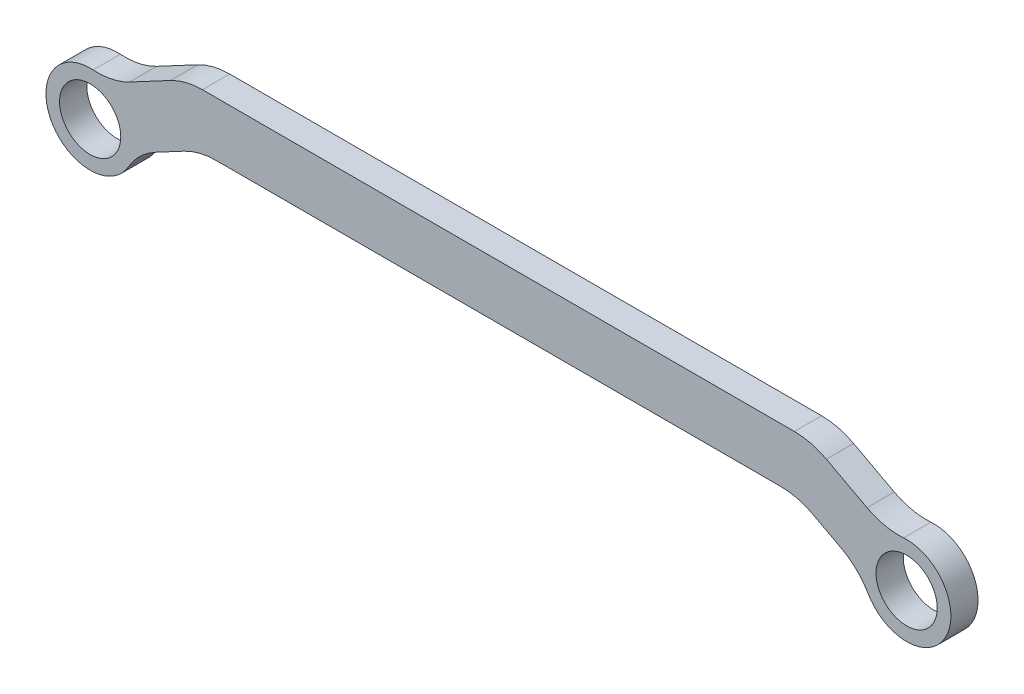
ISO-10303-21;
HEADER;
FILE_DESCRIPTION(('STEP AP214'),'2;1');
FILE_NAME('part.step','',(''),(''),'','','');
FILE_SCHEMA(('AUTOMOTIVE_DESIGN { 1 0 10303 214 1 1 1 1 }'));
ENDSEC;
DATA;
#1=APPLICATION_CONTEXT('core data for automotive mechanical design processes');
#2=APPLICATION_PROTOCOL_DEFINITION('international standard','automotive_design',2000,#1);
#3=PRODUCT_CONTEXT('',#1,'mechanical');
#4=PRODUCT('Part','Part','',(#3));
#5=PRODUCT_RELATED_PRODUCT_CATEGORY('part','',(#4));
#6=PRODUCT_DEFINITION_FORMATION('','',#4);
#7=PRODUCT_DEFINITION_CONTEXT('part definition',#1,'design');
#8=PRODUCT_DEFINITION('design','',#6,#7);
#9=PRODUCT_DEFINITION_SHAPE('','',#8);
#10=(LENGTH_UNIT() NAMED_UNIT(*) SI_UNIT(.MILLI.,.METRE.));
#11=(NAMED_UNIT(*) PLANE_ANGLE_UNIT() SI_UNIT($,.RADIAN.));
#12=(NAMED_UNIT(*) SI_UNIT($,.STERADIAN.) SOLID_ANGLE_UNIT());
#13=UNCERTAINTY_MEASURE_WITH_UNIT(LENGTH_MEASURE(1.E-05),#10,'distance_accuracy_value','');
#14=(GEOMETRIC_REPRESENTATION_CONTEXT(3) GLOBAL_UNCERTAINTY_ASSIGNED_CONTEXT((#13)) GLOBAL_UNIT_ASSIGNED_CONTEXT((#10,
#11,#12)) REPRESENTATION_CONTEXT('',''));
#15=CARTESIAN_POINT('',(0.,0.,0.));
#16=DIRECTION('',(0.,0.,1.));
#17=DIRECTION('',(1.,0.,0.));
#18=AXIS2_PLACEMENT_3D('',#15,#16,#17);
#19=CARTESIAN_POINT('',(24.6920415224913,46.2975778546712,4.));
#20=DIRECTION('',(0.470588235294117,0.882352941176471,0.));
#21=DIRECTION('',(-0.882352941176471,0.470588235294117,0.));
#22=AXIS2_PLACEMENT_3D('',#19,#20,#21);
#23=PLANE('',#22);
#24=DIRECTION('',(0.882352941176471,-0.470588235294117,0.));
#25=VECTOR('',#24,1.);
#26=CARTESIAN_POINT('',(24.6920415224913,46.2975778546712,0.));
#27=LINE('',#26,#25);
#28=CARTESIAN_POINT('',(106.205882352941,2.82352941176469,0.));
#29=VERTEX_POINT('',#28);
#30=CARTESIAN_POINT('',(110.412831236806,0.579823340370093,0.));
#31=VERTEX_POINT('',#30);
#32=EDGE_CURVE('E192',#29,#31,#27,.T.);
#33=ORIENTED_EDGE('',*,*,#32,.T.);
#34=DIRECTION('',(0.,0.,1.));
#35=VECTOR('',#34,1.);
#36=CARTESIAN_POINT('',(110.412831236806,0.579823340370121,4.));
#37=LINE('',#36,#35);
#38=CARTESIAN_POINT('',(110.412831236806,0.579823340370093,4.));
#39=VERTEX_POINT('',#38);
#40=EDGE_CURVE('E164',#31,#39,#37,.T.);
#41=ORIENTED_EDGE('',*,*,#40,.T.);
#42=DIRECTION('',(0.882352941176471,-0.470588235294117,0.));
#43=VECTOR('',#42,1.);
#44=CARTESIAN_POINT('',(24.6920415224913,46.2975778546712,4.));
#45=LINE('',#44,#43);
#46=CARTESIAN_POINT('',(106.205882352941,2.82352941176469,4.));
#47=VERTEX_POINT('',#46);
#48=EDGE_CURVE('E226',#47,#39,#45,.T.);
#49=ORIENTED_EDGE('',*,*,#48,.F.);
#50=DIRECTION('',(0.,0.,-1.));
#51=VECTOR('',#50,1.);
#52=CARTESIAN_POINT('',(106.205882352941,2.82352941176471,0.));
#53=LINE('',#52,#51);
#54=EDGE_CURVE('E182',#47,#29,#53,.T.);
#55=ORIENTED_EDGE('',*,*,#54,.T.);
#56=EDGE_LOOP('',(#33,#41,#49,#55));
#57=FACE_BOUND('',#56,.T.);
#58=ADVANCED_FACE('F44',(#57),#23,.F.);
#59=CARTESIAN_POINT('',(120.,0.,4.));
#60=DIRECTION('',(0.,0.,-1.));
#61=DIRECTION('',(-1.,0.,0.));
#62=AXIS2_PLACEMENT_3D('',#59,#60,#61);
#63=CYLINDRICAL_SURFACE('',#62,6.50000000000001);
#64=CARTESIAN_POINT('',(120.,0.,4.));
#65=DIRECTION('',(0.,0.,1.));
#66=DIRECTION('',(1.,0.,0.));
#67=AXIS2_PLACEMENT_3D('',#64,#65,#66);
#68=CIRCLE('',#67,6.50000000000001);
#69=CARTESIAN_POINT('',(114.369404105765,-3.2475205735797,4.));
#70=VERTEX_POINT('',#69);
#71=CARTESIAN_POINT('',(119.560134943555,6.48509974727594,4.));
#72=VERTEX_POINT('',#71);
#73=EDGE_CURVE('E180',#70,#72,#68,.T.);
#74=ORIENTED_EDGE('',*,*,#73,.F.);
#75=DIRECTION('',(0.,0.,-1.));
#76=VECTOR('',#75,1.);
#77=CARTESIAN_POINT('',(114.369404105765,-3.24752057357969,4.));
#78=LINE('',#77,#76);
#79=CARTESIAN_POINT('',(114.369404105765,-3.2475205735797,0.));
#80=VERTEX_POINT('',#79);
#81=EDGE_CURVE('E163',#70,#80,#78,.T.);
#82=ORIENTED_EDGE('',*,*,#81,.T.);
#83=CARTESIAN_POINT('',(120.,0.,0.));
#84=DIRECTION('',(0.,0.,1.));
#85=DIRECTION('',(1.,0.,0.));
#86=AXIS2_PLACEMENT_3D('',#83,#84,#85);
#87=CIRCLE('',#86,6.50000000000001);
#88=CARTESIAN_POINT('',(119.560134943555,6.48509974727594,0.));
#89=VERTEX_POINT('',#88);
#90=EDGE_CURVE('E177',#80,#89,#87,.T.);
#91=ORIENTED_EDGE('',*,*,#90,.T.);
#92=DIRECTION('',(0.,0.,-1.));
#93=VECTOR('',#92,1.);
#94=CARTESIAN_POINT('',(119.560134943555,6.48509974727594,4.));
#95=LINE('',#94,#93);
#96=EDGE_CURVE('E183',#89,#72,#95,.F.);
#97=ORIENTED_EDGE('',*,*,#96,.T.);
#98=EDGE_LOOP('',(#74,#82,#91,#97));
#99=FACE_BOUND('',#98,.T.);
#100=ADVANCED_FACE('F176',(#99),#63,.T.);
#101=CARTESIAN_POINT('',(28.4567474048442,53.356401384083,4.));
#102=DIRECTION('',(0.470588235294117,0.882352941176471,0.));
#103=DIRECTION('',(-0.882352941176471,0.470588235294117,0.));
#104=AXIS2_PLACEMENT_3D('',#101,#102,#103);
#105=PLANE('',#104);
#106=DIRECTION('',(0.882352941176471,-0.470588235294117,0.));
#107=VECTOR('',#106,1.);
#108=CARTESIAN_POINT('',(28.4567474048442,53.356401384083,4.));
#109=LINE('',#108,#107);
#110=CARTESIAN_POINT('',(108.205882352941,10.8235294117647,4.));
#111=VERTEX_POINT('',#110);
#112=CARTESIAN_POINT('',(114.177537119159,7.63864686978188,4.));
#113=VERTEX_POINT('',#112);
#114=EDGE_CURVE('E417',#111,#113,#109,.T.);
#115=ORIENTED_EDGE('',*,*,#114,.T.);
#116=DIRECTION('',(0.,0.,-1.));
#117=VECTOR('',#116,1.);
#118=CARTESIAN_POINT('',(114.177537119159,7.63864686978189,4.));
#119=LINE('',#118,#117);
#120=CARTESIAN_POINT('',(114.177537119159,7.63864686978188,0.));
#121=VERTEX_POINT('',#120);
#122=EDGE_CURVE('E238',#113,#121,#119,.T.);
#123=ORIENTED_EDGE('',*,*,#122,.T.);
#124=DIRECTION('',(0.882352941176471,-0.470588235294117,0.));
#125=VECTOR('',#124,1.);
#126=CARTESIAN_POINT('',(28.4567474048442,53.356401384083,0.));
#127=LINE('',#126,#125);
#128=CARTESIAN_POINT('',(108.205882352941,10.8235294117647,0.));
#129=VERTEX_POINT('',#128);
#130=EDGE_CURVE('E191',#129,#121,#127,.T.);
#131=ORIENTED_EDGE('',*,*,#130,.F.);
#132=DIRECTION('',(0.,0.,-1.));
#133=VECTOR('',#132,1.);
#134=CARTESIAN_POINT('',(108.205882352941,10.8235294117647,4.));
#135=LINE('',#134,#133);
#136=EDGE_CURVE('E235',#129,#111,#135,.F.);
#137=ORIENTED_EDGE('',*,*,#136,.T.);
#138=EDGE_LOOP('',(#115,#123,#131,#137));
#139=FACE_BOUND('',#138,.T.);
#140=ADVANCED_FACE('F370',(#139),#105,.T.);
#141=CARTESIAN_POINT('',(0.,12.,4.));
#142=DIRECTION('',(0.,1.,0.));
#143=DIRECTION('',(0.,0.,1.));
#144=AXIS2_PLACEMENT_3D('',#141,#142,#143);
#145=PLANE('',#144);
#146=DIRECTION('',(1.,0.,0.));
#147=VECTOR('',#146,1.);
#148=CARTESIAN_POINT('',(0.,12.,4.));
#149=LINE('',#148,#147);
#150=CARTESIAN_POINT('',(16.5,12.,4.));
#151=VERTEX_POINT('',#150);
#152=CARTESIAN_POINT('',(103.5,12.,4.));
#153=VERTEX_POINT('',#152);
#154=EDGE_CURVE('E338',#151,#153,#149,.T.);
#155=ORIENTED_EDGE('',*,*,#154,.T.);
#156=DIRECTION('',(0.,0.,-1.));
#157=VECTOR('',#156,1.);
#158=CARTESIAN_POINT('',(103.5,12.,4.));
#159=LINE('',#158,#157);
#160=CARTESIAN_POINT('',(103.5,12.,0.));
#161=VERTEX_POINT('',#160);
#162=EDGE_CURVE('E252',#153,#161,#159,.T.);
#163=ORIENTED_EDGE('',*,*,#162,.T.);
#164=DIRECTION('',(1.,0.,0.));
#165=VECTOR('',#164,1.);
#166=CARTESIAN_POINT('',(0.,12.,0.));
#167=LINE('',#166,#165);
#168=CARTESIAN_POINT('',(16.5,12.,0.));
#169=VERTEX_POINT('',#168);
#170=EDGE_CURVE('E196',#169,#161,#167,.T.);
#171=ORIENTED_EDGE('',*,*,#170,.F.);
#172=DIRECTION('',(0.,0.,-1.));
#173=VECTOR('',#172,1.);
#174=CARTESIAN_POINT('',(16.5,12.,4.));
#175=LINE('',#174,#173);
#176=EDGE_CURVE('E249',#169,#151,#175,.F.);
#177=ORIENTED_EDGE('',*,*,#176,.T.);
#178=EDGE_LOOP('',(#155,#163,#171,#177));
#179=FACE_BOUND('',#178,.T.);
#180=ADVANCED_FACE('F427',(#179),#145,.T.);
#181=CARTESIAN_POINT('',(-1.88235294117647,3.52941176470588,4.));
#182=DIRECTION('',(-0.470588235294118,0.88235294117647,0.));
#183=DIRECTION('',(-0.882352941176471,-0.470588235294118,0.));
#184=AXIS2_PLACEMENT_3D('',#181,#182,#183);
#185=PLANE('',#184);
#186=DIRECTION('',(0.882352941176471,0.470588235294118,0.));
#187=VECTOR('',#186,1.);
#188=CARTESIAN_POINT('',(-1.88235294117647,3.52941176470588,4.));
#189=LINE('',#188,#187);
#190=CARTESIAN_POINT('',(5.82246288084103,7.63864686978188,4.));
#191=VERTEX_POINT('',#190);
#192=CARTESIAN_POINT('',(11.7941176470588,10.8235294117647,4.));
#193=VERTEX_POINT('',#192);
#194=EDGE_CURVE('E327',#191,#193,#189,.T.);
#195=ORIENTED_EDGE('',*,*,#194,.T.);
#196=DIRECTION('',(0.,0.,-1.));
#197=VECTOR('',#196,1.);
#198=CARTESIAN_POINT('',(11.7941176470588,10.8235294117647,4.));
#199=LINE('',#198,#197);
#200=CARTESIAN_POINT('',(11.7941176470588,10.8235294117647,0.));
#201=VERTEX_POINT('',#200);
#202=EDGE_CURVE('E277',#193,#201,#199,.T.);
#203=ORIENTED_EDGE('',*,*,#202,.T.);
#204=DIRECTION('',(0.882352941176471,0.470588235294118,0.));
#205=VECTOR('',#204,1.);
#206=CARTESIAN_POINT('',(-1.88235294117647,3.52941176470588,0.));
#207=LINE('',#206,#205);
#208=CARTESIAN_POINT('',(5.82246288084103,7.63864686978188,0.));
#209=VERTEX_POINT('',#208);
#210=EDGE_CURVE('E203',#209,#201,#207,.T.);
#211=ORIENTED_EDGE('',*,*,#210,.F.);
#212=DIRECTION('',(0.,0.,-1.));
#213=VECTOR('',#212,1.);
#214=CARTESIAN_POINT('',(5.82246288084103,7.63864686978188,4.));
#215=LINE('',#214,#213);
#216=EDGE_CURVE('E274',#209,#191,#215,.F.);
#217=ORIENTED_EDGE('',*,*,#216,.T.);
#218=EDGE_LOOP('',(#195,#203,#211,#217));
#219=FACE_BOUND('',#218,.T.);
#220=ADVANCED_FACE('F318',(#219),#185,.T.);
#221=CARTESIAN_POINT('',(0.,0.,4.));
#222=DIRECTION('',(0.,0.,-1.));
#223=DIRECTION('',(-1.,0.,0.));
#224=AXIS2_PLACEMENT_3D('',#221,#222,#223);
#225=CYLINDRICAL_SURFACE('',#224,6.5);
#226=CARTESIAN_POINT('',(0.,0.,0.));
#227=DIRECTION('',(0.,0.,1.));
#228=DIRECTION('',(1.,0.,0.));
#229=AXIS2_PLACEMENT_3D('',#226,#227,#228);
#230=CIRCLE('',#229,6.5);
#231=CARTESIAN_POINT('',(0.439865056445396,6.48509974727593,0.));
#232=VERTEX_POINT('',#231);
#233=CARTESIAN_POINT('',(5.63059589423506,-3.24752057357969,0.));
#234=VERTEX_POINT('',#233);
#235=EDGE_CURVE('E207',#232,#234,#230,.T.);
#236=ORIENTED_EDGE('',*,*,#235,.T.);
#237=DIRECTION('',(0.,0.,-1.));
#238=VECTOR('',#237,1.);
#239=CARTESIAN_POINT('',(5.63059589423506,-3.24752057357969,4.));
#240=LINE('',#239,#238);
#241=CARTESIAN_POINT('',(5.63059589423506,-3.24752057357969,4.));
#242=VERTEX_POINT('',#241);
#243=EDGE_CURVE('E171',#234,#242,#240,.F.);
#244=ORIENTED_EDGE('',*,*,#243,.T.);
#245=CARTESIAN_POINT('',(0.,0.,4.));
#246=DIRECTION('',(0.,0.,1.));
#247=DIRECTION('',(1.,0.,0.));
#248=AXIS2_PLACEMENT_3D('',#245,#246,#247);
#249=CIRCLE('',#248,6.5);
#250=CARTESIAN_POINT('',(0.439865056445396,6.48509974727593,4.));
#251=VERTEX_POINT('',#250);
#252=EDGE_CURVE('E326',#251,#242,#249,.T.);
#253=ORIENTED_EDGE('',*,*,#252,.F.);
#254=DIRECTION('',(0.,0.,-1.));
#255=VECTOR('',#254,1.);
#256=CARTESIAN_POINT('',(0.439865056445396,6.48509974727593,4.));
#257=LINE('',#256,#255);
#258=EDGE_CURVE('E281',#251,#232,#257,.T.);
#259=ORIENTED_EDGE('',*,*,#258,.T.);
#260=EDGE_LOOP('',(#236,#244,#253,#259));
#261=FACE_BOUND('',#260,.T.);
#262=ADVANCED_FACE('F329',(#261),#225,.T.);
#263=CARTESIAN_POINT('',(1.88235294117647,-3.52941176470588,4.));
#264=DIRECTION('',(-0.470588235294118,0.88235294117647,0.));
#265=DIRECTION('',(-0.882352941176471,-0.470588235294118,0.));
#266=AXIS2_PLACEMENT_3D('',#263,#264,#265);
#267=PLANE('',#266);
#268=DIRECTION('',(0.882352941176471,0.470588235294118,0.));
#269=VECTOR('',#268,1.);
#270=CARTESIAN_POINT('',(1.88235294117647,-3.52941176470588,0.));
#271=LINE('',#270,#269);
#272=CARTESIAN_POINT('',(9.58716876319397,0.579823340370114,0.));
#273=VERTEX_POINT('',#272);
#274=CARTESIAN_POINT('',(13.7941176470588,2.82352941176471,0.));
#275=VERTEX_POINT('',#274);
#276=EDGE_CURVE('E211',#273,#275,#271,.T.);
#277=ORIENTED_EDGE('',*,*,#276,.T.);
#278=DIRECTION('',(0.,0.,-1.));
#279=VECTOR('',#278,1.);
#280=CARTESIAN_POINT('',(13.7941176470588,2.8235294117647,4.));
#281=LINE('',#280,#279);
#282=CARTESIAN_POINT('',(13.7941176470588,2.82352941176471,4.));
#283=VERTEX_POINT('',#282);
#284=EDGE_CURVE('E60',#275,#283,#281,.F.);
#285=ORIENTED_EDGE('',*,*,#284,.T.);
#286=DIRECTION('',(0.882352941176471,0.470588235294118,0.));
#287=VECTOR('',#286,1.);
#288=CARTESIAN_POINT('',(1.88235294117647,-3.52941176470588,4.));
#289=LINE('',#288,#287);
#290=CARTESIAN_POINT('',(9.58716876319397,0.579823340370114,4.));
#291=VERTEX_POINT('',#290);
#292=EDGE_CURVE('E332',#291,#283,#289,.T.);
#293=ORIENTED_EDGE('',*,*,#292,.F.);
#294=DIRECTION('',(0.,0.,1.));
#295=VECTOR('',#294,1.);
#296=CARTESIAN_POINT('',(9.58716876319396,0.579823340370113,0.));
#297=LINE('',#296,#295);
#298=EDGE_CURVE('E268',#291,#273,#297,.F.);
#299=ORIENTED_EDGE('',*,*,#298,.T.);
#300=EDGE_LOOP('',(#277,#285,#293,#299));
#301=FACE_BOUND('',#300,.T.);
#302=ADVANCED_FACE('F403',(#301),#267,.F.);
#303=CARTESIAN_POINT('',(0.,0.,4.));
#304=DIRECTION('',(0.,0.,-1.));
#305=DIRECTION('',(-1.,0.,0.));
#306=AXIS2_PLACEMENT_3D('',#303,#304,#305);
#307=CYLINDRICAL_SURFACE('',#306,4.5);
#308=CARTESIAN_POINT('',(0.,0.,4.));
#309=DIRECTION('',(0.,0.,1.));
#310=DIRECTION('',(1.,0.,0.));
#311=AXIS2_PLACEMENT_3D('',#308,#309,#310);
#312=CIRCLE('',#311,4.5);
#313=CARTESIAN_POINT('',(4.5,0.,4.));
#314=VERTEX_POINT('',#313);
#315=EDGE_CURVE('E345',#314,#314,#312,.T.);
#316=ORIENTED_EDGE('',*,*,#315,.T.);
#317=EDGE_LOOP('',(#316));
#318=FACE_BOUND('',#317,.T.);
#319=CARTESIAN_POINT('',(0.,0.,0.));
#320=DIRECTION('',(0.,0.,1.));
#321=DIRECTION('',(1.,0.,0.));
#322=AXIS2_PLACEMENT_3D('',#319,#320,#321);
#323=CIRCLE('',#322,4.5);
#324=CARTESIAN_POINT('',(4.5,0.,0.));
#325=VERTEX_POINT('',#324);
#326=EDGE_CURVE('E218',#325,#325,#323,.T.);
#327=ORIENTED_EDGE('',*,*,#326,.F.);
#328=EDGE_LOOP('',(#327));
#329=FACE_BOUND('',#328,.T.);
#330=ADVANCED_FACE('F449',(#318,#329),#307,.F.);
#331=CARTESIAN_POINT('',(0.,4.,4.));
#332=DIRECTION('',(0.,1.,0.));
#333=DIRECTION('',(0.,0.,1.));
#334=AXIS2_PLACEMENT_3D('',#331,#332,#333);
#335=PLANE('',#334);
#336=DIRECTION('',(1.,0.,0.));
#337=VECTOR('',#336,1.);
#338=CARTESIAN_POINT('',(0.,4.,0.));
#339=LINE('',#338,#337);
#340=CARTESIAN_POINT('',(18.5,4.,0.));
#341=VERTEX_POINT('',#340);
#342=CARTESIAN_POINT('',(101.5,4.,0.));
#343=VERTEX_POINT('',#342);
#344=EDGE_CURVE('E214',#341,#343,#339,.T.);
#345=ORIENTED_EDGE('',*,*,#344,.T.);
#346=DIRECTION('',(0.,0.,-1.));
#347=VECTOR('',#346,1.);
#348=CARTESIAN_POINT('',(101.5,4.,4.));
#349=LINE('',#348,#347);
#350=CARTESIAN_POINT('',(101.5,4.,4.));
#351=VERTEX_POINT('',#350);
#352=EDGE_CURVE('E246',#343,#351,#349,.F.);
#353=ORIENTED_EDGE('',*,*,#352,.T.);
#354=DIRECTION('',(1.,0.,0.));
#355=VECTOR('',#354,1.);
#356=CARTESIAN_POINT('',(0.,4.,4.));
#357=LINE('',#356,#355);
#358=CARTESIAN_POINT('',(18.5,4.,4.));
#359=VERTEX_POINT('',#358);
#360=EDGE_CURVE('E336',#359,#351,#357,.T.);
#361=ORIENTED_EDGE('',*,*,#360,.F.);
#362=DIRECTION('',(0.,0.,-1.));
#363=VECTOR('',#362,1.);
#364=CARTESIAN_POINT('',(18.5,4.,0.));
#365=LINE('',#364,#363);
#366=EDGE_CURVE('E242',#359,#341,#365,.T.);
#367=ORIENTED_EDGE('',*,*,#366,.T.);
#368=EDGE_LOOP('',(#345,#353,#361,#367));
#369=FACE_BOUND('',#368,.T.);
#370=ADVANCED_FACE('F362',(#369),#335,.F.);
#371=CARTESIAN_POINT('',(120.,0.,4.));
#372=DIRECTION('',(0.,0.,-1.));
#373=DIRECTION('',(-1.,0.,0.));
#374=AXIS2_PLACEMENT_3D('',#371,#372,#373);
#375=CYLINDRICAL_SURFACE('',#374,4.5);
#376=CARTESIAN_POINT('',(120.,0.,4.));
#377=DIRECTION('',(0.,0.,1.));
#378=DIRECTION('',(1.,0.,0.));
#379=AXIS2_PLACEMENT_3D('',#376,#377,#378);
#380=CIRCLE('',#379,4.5);
#381=CARTESIAN_POINT('',(124.5,0.,4.));
#382=VERTEX_POINT('',#381);
#383=EDGE_CURVE('E228',#382,#382,#380,.T.);
#384=ORIENTED_EDGE('',*,*,#383,.T.);
#385=EDGE_LOOP('',(#384));
#386=FACE_BOUND('',#385,.T.);
#387=CARTESIAN_POINT('',(120.,0.,0.));
#388=DIRECTION('',(0.,0.,1.));
#389=DIRECTION('',(1.,0.,0.));
#390=AXIS2_PLACEMENT_3D('',#387,#388,#389);
#391=CIRCLE('',#390,4.5);
#392=CARTESIAN_POINT('',(124.5,0.,0.));
#393=VERTEX_POINT('',#392);
#394=EDGE_CURVE('E222',#393,#393,#391,.T.);
#395=ORIENTED_EDGE('',*,*,#394,.F.);
#396=EDGE_LOOP('',(#395));
#397=FACE_BOUND('',#396,.T.);
#398=ADVANCED_FACE('F352',(#386,#397),#375,.F.);
#399=CARTESIAN_POINT('',(0.,0.,4.));
#400=DIRECTION('',(0.,0.,1.));
#401=DIRECTION('',(1.,0.,0.));
#402=AXIS2_PLACEMENT_3D('',#399,#400,#401);
#403=PLANE('',#402);
#404=ORIENTED_EDGE('',*,*,#114,.F.);
#405=CARTESIAN_POINT('',(103.5,2.,4.));
#406=DIRECTION('',(0.,0.,1.));
#407=DIRECTION('',(1.,0.,0.));
#408=AXIS2_PLACEMENT_3D('',#405,#406,#407);
#409=CIRCLE('',#408,10.);
#410=EDGE_CURVE('E265',#111,#153,#409,.T.);
#411=ORIENTED_EDGE('',*,*,#410,.T.);
#412=ORIENTED_EDGE('',*,*,#154,.F.);
#413=CARTESIAN_POINT('',(16.5,2.,4.));
#414=DIRECTION('',(0.,0.,1.));
#415=DIRECTION('',(1.,0.,0.));
#416=AXIS2_PLACEMENT_3D('',#413,#414,#415);
#417=CIRCLE('',#416,10.);
#418=EDGE_CURVE('E262',#151,#193,#417,.T.);
#419=ORIENTED_EDGE('',*,*,#418,.T.);
#420=ORIENTED_EDGE('',*,*,#194,.F.);
#421=CARTESIAN_POINT('',(1.11658052789985,16.4621762815466,4.));
#422=DIRECTION('',(0.,0.,1.));
#423=DIRECTION('',(1.,0.,0.));
#424=AXIS2_PLACEMENT_3D('',#421,#422,#423);
#425=CIRCLE('',#424,10.);
#426=EDGE_CURVE('E11',#191,#251,#425,.F.);
#427=ORIENTED_EDGE('',*,*,#426,.T.);
#428=ORIENTED_EDGE('',*,*,#252,.T.);
#429=CARTESIAN_POINT('',(14.2930511161351,-8.24370607139459,4.));
#430=DIRECTION('',(0.,0.,1.));
#431=DIRECTION('',(1.,0.,0.));
#432=AXIS2_PLACEMENT_3D('',#429,#430,#431);
#433=CIRCLE('',#432,10.);
#434=EDGE_CURVE('E67',#242,#291,#433,.F.);
#435=ORIENTED_EDGE('',*,*,#434,.T.);
#436=ORIENTED_EDGE('',*,*,#292,.T.);
#437=CARTESIAN_POINT('',(18.5,-6.,4.));
#438=DIRECTION('',(0.,0.,1.));
#439=DIRECTION('',(1.,0.,0.));
#440=AXIS2_PLACEMENT_3D('',#437,#438,#439);
#441=CIRCLE('',#440,10.);
#442=EDGE_CURVE('E303',#283,#359,#441,.F.);
#443=ORIENTED_EDGE('',*,*,#442,.T.);
#444=ORIENTED_EDGE('',*,*,#360,.T.);
#445=CARTESIAN_POINT('',(101.5,-6.,4.));
#446=DIRECTION('',(0.,0.,1.));
#447=DIRECTION('',(1.,0.,0.));
#448=AXIS2_PLACEMENT_3D('',#445,#446,#447);
#449=CIRCLE('',#448,10.);
#450=EDGE_CURVE('E297',#351,#47,#449,.F.);
#451=ORIENTED_EDGE('',*,*,#450,.T.);
#452=ORIENTED_EDGE('',*,*,#48,.T.);
#453=CARTESIAN_POINT('',(105.706948883865,-8.24370607139459,4.));
#454=DIRECTION('',(0.,0.,1.));
#455=DIRECTION('',(1.,0.,0.));
#456=AXIS2_PLACEMENT_3D('',#453,#454,#455);
#457=CIRCLE('',#456,10.);
#458=EDGE_CURVE('E170',#39,#70,#457,.F.);
#459=ORIENTED_EDGE('',*,*,#458,.T.);
#460=ORIENTED_EDGE('',*,*,#73,.T.);
#461=CARTESIAN_POINT('',(118.8834194721,16.4621762815466,4.));
#462=DIRECTION('',(0.,0.,1.));
#463=DIRECTION('',(1.,0.,0.));
#464=AXIS2_PLACEMENT_3D('',#461,#462,#463);
#465=CIRCLE('',#464,10.);
#466=EDGE_CURVE('E291',#72,#113,#465,.F.);
#467=ORIENTED_EDGE('',*,*,#466,.T.);
#468=EDGE_LOOP('',(#404,#411,#412,#419,#420,#427,#428,#435,#436,#443,#444,#451,#452,#459,#460,#467));
#469=FACE_BOUND('',#468,.T.);
#470=ORIENTED_EDGE('',*,*,#315,.F.);
#471=EDGE_LOOP('',(#470));
#472=FACE_BOUND('',#471,.T.);
#473=ORIENTED_EDGE('',*,*,#383,.F.);
#474=EDGE_LOOP('',(#473));
#475=FACE_BOUND('',#474,.T.);
#476=ADVANCED_FACE('F324',(#469,#472,#475),#403,.T.);
#477=CARTESIAN_POINT('',(0.,0.,0.));
#478=DIRECTION('',(0.,0.,1.));
#479=DIRECTION('',(1.,0.,0.));
#480=AXIS2_PLACEMENT_3D('',#477,#478,#479);
#481=PLANE('',#480);
#482=ORIENTED_EDGE('',*,*,#170,.T.);
#483=CARTESIAN_POINT('',(103.5,2.,0.));
#484=DIRECTION('',(0.,0.,1.));
#485=DIRECTION('',(1.,0.,0.));
#486=AXIS2_PLACEMENT_3D('',#483,#484,#485);
#487=CIRCLE('',#486,10.);
#488=EDGE_CURVE('E259',#161,#129,#487,.F.);
#489=ORIENTED_EDGE('',*,*,#488,.T.);
#490=ORIENTED_EDGE('',*,*,#130,.T.);
#491=CARTESIAN_POINT('',(118.8834194721,16.4621762815466,0.));
#492=DIRECTION('',(0.,0.,1.));
#493=DIRECTION('',(1.,0.,0.));
#494=AXIS2_PLACEMENT_3D('',#491,#492,#493);
#495=CIRCLE('',#494,10.);
#496=EDGE_CURVE('E189',#121,#89,#495,.T.);
#497=ORIENTED_EDGE('',*,*,#496,.T.);
#498=ORIENTED_EDGE('',*,*,#90,.F.);
#499=CARTESIAN_POINT('',(105.706948883865,-8.24370607139459,0.));
#500=DIRECTION('',(0.,0.,1.));
#501=DIRECTION('',(1.,0.,0.));
#502=AXIS2_PLACEMENT_3D('',#499,#500,#501);
#503=CIRCLE('',#502,10.);
#504=EDGE_CURVE('E159',#80,#31,#503,.T.);
#505=ORIENTED_EDGE('',*,*,#504,.T.);
#506=ORIENTED_EDGE('',*,*,#32,.F.);
#507=CARTESIAN_POINT('',(101.5,-6.,0.));
#508=DIRECTION('',(0.,0.,1.));
#509=DIRECTION('',(1.,0.,0.));
#510=AXIS2_PLACEMENT_3D('',#507,#508,#509);
#511=CIRCLE('',#510,10.);
#512=EDGE_CURVE('E294',#29,#343,#511,.T.);
#513=ORIENTED_EDGE('',*,*,#512,.T.);
#514=ORIENTED_EDGE('',*,*,#344,.F.);
#515=CARTESIAN_POINT('',(18.5,-6.,0.));
#516=DIRECTION('',(0.,0.,1.));
#517=DIRECTION('',(1.,0.,0.));
#518=AXIS2_PLACEMENT_3D('',#515,#516,#517);
#519=CIRCLE('',#518,10.);
#520=EDGE_CURVE('E300',#341,#275,#519,.T.);
#521=ORIENTED_EDGE('',*,*,#520,.T.);
#522=ORIENTED_EDGE('',*,*,#276,.F.);
#523=CARTESIAN_POINT('',(14.2930511161351,-8.24370607139459,0.));
#524=DIRECTION('',(0.,0.,1.));
#525=DIRECTION('',(1.,0.,0.));
#526=AXIS2_PLACEMENT_3D('',#523,#524,#525);
#527=CIRCLE('',#526,10.);
#528=EDGE_CURVE('E306',#273,#234,#527,.T.);
#529=ORIENTED_EDGE('',*,*,#528,.T.);
#530=ORIENTED_EDGE('',*,*,#235,.F.);
#531=CARTESIAN_POINT('',(1.11658052789985,16.4621762815466,0.));
#532=DIRECTION('',(0.,0.,1.));
#533=DIRECTION('',(1.,0.,0.));
#534=AXIS2_PLACEMENT_3D('',#531,#532,#533);
#535=CIRCLE('',#534,10.);
#536=EDGE_CURVE('E53',#232,#209,#535,.T.);
#537=ORIENTED_EDGE('',*,*,#536,.T.);
#538=ORIENTED_EDGE('',*,*,#210,.T.);
#539=CARTESIAN_POINT('',(16.5,2.,0.));
#540=DIRECTION('',(0.,0.,1.));
#541=DIRECTION('',(1.,0.,0.));
#542=AXIS2_PLACEMENT_3D('',#539,#540,#541);
#543=CIRCLE('',#542,10.);
#544=EDGE_CURVE('E256',#201,#169,#543,.F.);
#545=ORIENTED_EDGE('',*,*,#544,.T.);
#546=EDGE_LOOP('',(#482,#489,#490,#497,#498,#505,#506,#513,#514,#521,#522,#529,#530,#537,#538,#545));
#547=FACE_BOUND('',#546,.T.);
#548=ORIENTED_EDGE('',*,*,#326,.T.);
#549=EDGE_LOOP('',(#548));
#550=FACE_BOUND('',#549,.T.);
#551=ORIENTED_EDGE('',*,*,#394,.T.);
#552=EDGE_LOOP('',(#551));
#553=FACE_BOUND('',#552,.T.);
#554=ADVANCED_FACE('F186',(#547,#550,#553),#481,.F.);
#555=CARTESIAN_POINT('',(105.706948883865,-8.24370607139459,4.));
#556=DIRECTION('',(0.,0.,-1.));
#557=DIRECTION('',(-1.,0.,0.));
#558=AXIS2_PLACEMENT_3D('',#555,#556,#557);
#559=CYLINDRICAL_SURFACE('',#558,10.);
#560=ORIENTED_EDGE('',*,*,#458,.F.);
#561=ORIENTED_EDGE('',*,*,#40,.F.);
#562=ORIENTED_EDGE('',*,*,#504,.F.);
#563=ORIENTED_EDGE('',*,*,#81,.F.);
#564=EDGE_LOOP('',(#560,#561,#562,#563));
#565=FACE_BOUND('',#564,.T.);
#566=ADVANCED_FACE('F162',(#565),#559,.F.);
#567=CARTESIAN_POINT('',(118.8834194721,16.4621762815466,4.));
#568=DIRECTION('',(0.,0.,-1.));
#569=DIRECTION('',(-1.,0.,0.));
#570=AXIS2_PLACEMENT_3D('',#567,#568,#569);
#571=CYLINDRICAL_SURFACE('',#570,10.);
#572=ORIENTED_EDGE('',*,*,#466,.F.);
#573=ORIENTED_EDGE('',*,*,#96,.F.);
#574=ORIENTED_EDGE('',*,*,#496,.F.);
#575=ORIENTED_EDGE('',*,*,#122,.F.);
#576=EDGE_LOOP('',(#572,#573,#574,#575));
#577=FACE_BOUND('',#576,.T.);
#578=ADVANCED_FACE('F376',(#577),#571,.F.);
#579=CARTESIAN_POINT('',(101.5,-6.,4.));
#580=DIRECTION('',(0.,0.,1.));
#581=DIRECTION('',(1.,0.,0.));
#582=AXIS2_PLACEMENT_3D('',#579,#580,#581);
#583=CYLINDRICAL_SURFACE('',#582,10.);
#584=ORIENTED_EDGE('',*,*,#450,.F.);
#585=ORIENTED_EDGE('',*,*,#352,.F.);
#586=ORIENTED_EDGE('',*,*,#512,.F.);
#587=ORIENTED_EDGE('',*,*,#54,.F.);
#588=EDGE_LOOP('',(#584,#585,#586,#587));
#589=FACE_BOUND('',#588,.T.);
#590=ADVANCED_FACE('F379',(#589),#583,.F.);
#591=CARTESIAN_POINT('',(103.5,2.,4.));
#592=DIRECTION('',(0.,0.,-1.));
#593=DIRECTION('',(-1.,0.,0.));
#594=AXIS2_PLACEMENT_3D('',#591,#592,#593);
#595=CYLINDRICAL_SURFACE('',#594,10.);
#596=ORIENTED_EDGE('',*,*,#410,.F.);
#597=ORIENTED_EDGE('',*,*,#136,.F.);
#598=ORIENTED_EDGE('',*,*,#488,.F.);
#599=ORIENTED_EDGE('',*,*,#162,.F.);
#600=EDGE_LOOP('',(#596,#597,#598,#599));
#601=FACE_BOUND('',#600,.T.);
#602=ADVANCED_FACE('F383',(#601),#595,.T.);
#603=CARTESIAN_POINT('',(18.5,-6.,4.));
#604=DIRECTION('',(0.,0.,1.));
#605=DIRECTION('',(1.,0.,0.));
#606=AXIS2_PLACEMENT_3D('',#603,#604,#605);
#607=CYLINDRICAL_SURFACE('',#606,10.);
#608=ORIENTED_EDGE('',*,*,#442,.F.);
#609=ORIENTED_EDGE('',*,*,#284,.F.);
#610=ORIENTED_EDGE('',*,*,#520,.F.);
#611=ORIENTED_EDGE('',*,*,#366,.F.);
#612=EDGE_LOOP('',(#608,#609,#610,#611));
#613=FACE_BOUND('',#612,.T.);
#614=ADVANCED_FACE('F387',(#613),#607,.F.);
#615=CARTESIAN_POINT('',(16.5,2.,4.));
#616=DIRECTION('',(0.,0.,-1.));
#617=DIRECTION('',(-1.,0.,0.));
#618=AXIS2_PLACEMENT_3D('',#615,#616,#617);
#619=CYLINDRICAL_SURFACE('',#618,10.);
#620=ORIENTED_EDGE('',*,*,#418,.F.);
#621=ORIENTED_EDGE('',*,*,#176,.F.);
#622=ORIENTED_EDGE('',*,*,#544,.F.);
#623=ORIENTED_EDGE('',*,*,#202,.F.);
#624=EDGE_LOOP('',(#620,#621,#622,#623));
#625=FACE_BOUND('',#624,.T.);
#626=ADVANCED_FACE('F391',(#625),#619,.T.);
#627=CARTESIAN_POINT('',(14.2930511161351,-8.24370607139459,4.));
#628=DIRECTION('',(0.,0.,-1.));
#629=DIRECTION('',(-1.,0.,0.));
#630=AXIS2_PLACEMENT_3D('',#627,#628,#629);
#631=CYLINDRICAL_SURFACE('',#630,10.);
#632=ORIENTED_EDGE('',*,*,#434,.F.);
#633=ORIENTED_EDGE('',*,*,#243,.F.);
#634=ORIENTED_EDGE('',*,*,#528,.F.);
#635=ORIENTED_EDGE('',*,*,#298,.F.);
#636=EDGE_LOOP('',(#632,#633,#634,#635));
#637=FACE_BOUND('',#636,.T.);
#638=ADVANCED_FACE('F394',(#637),#631,.F.);
#639=CARTESIAN_POINT('',(1.11658052789985,16.4621762815466,4.));
#640=DIRECTION('',(0.,0.,-1.));
#641=DIRECTION('',(-1.,0.,0.));
#642=AXIS2_PLACEMENT_3D('',#639,#640,#641);
#643=CYLINDRICAL_SURFACE('',#642,10.);
#644=ORIENTED_EDGE('',*,*,#426,.F.);
#645=ORIENTED_EDGE('',*,*,#216,.F.);
#646=ORIENTED_EDGE('',*,*,#536,.F.);
#647=ORIENTED_EDGE('',*,*,#258,.F.);
#648=EDGE_LOOP('',(#644,#645,#646,#647));
#649=FACE_BOUND('',#648,.T.);
#650=ADVANCED_FACE('F46',(#649),#643,.F.);
#651=CLOSED_SHELL('',(#58,#100,#140,#180,#220,#262,#302,#330,#370,#398,#476,#554,#566,#578,#590,
#602,#614,#626,#638,#650));
#652=MANIFOLD_SOLID_BREP('B2',#651);
#653=ADVANCED_BREP_SHAPE_REPRESENTATION('',(#18,#652),#14);
#654=SHAPE_DEFINITION_REPRESENTATION(#9,#653);
ENDSEC;
END-ISO-10303-21;
